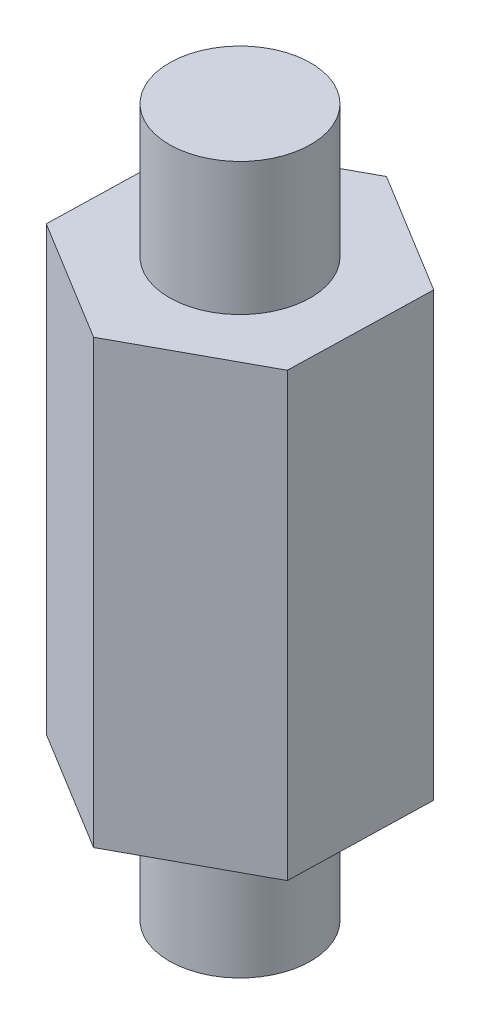
ISO-10303-21;
HEADER;
FILE_DESCRIPTION(('STEP AP214'),'2;1');
FILE_NAME('part.step','',(''),(''),'','','');
FILE_SCHEMA(('AUTOMOTIVE_DESIGN { 1 0 10303 214 1 1 1 1 }'));
ENDSEC;
DATA;
#1=APPLICATION_CONTEXT('core data for automotive mechanical design processes');
#2=APPLICATION_PROTOCOL_DEFINITION('international standard','automotive_design',2000,#1);
#3=PRODUCT_CONTEXT('',#1,'mechanical');
#4=PRODUCT('Part','Part','',(#3));
#5=PRODUCT_RELATED_PRODUCT_CATEGORY('part','',(#4));
#6=PRODUCT_DEFINITION_FORMATION('','',#4);
#7=PRODUCT_DEFINITION_CONTEXT('part definition',#1,'design');
#8=PRODUCT_DEFINITION('design','',#6,#7);
#9=PRODUCT_DEFINITION_SHAPE('','',#8);
#10=(LENGTH_UNIT() NAMED_UNIT(*) SI_UNIT(.MILLI.,.METRE.));
#11=(NAMED_UNIT(*) PLANE_ANGLE_UNIT() SI_UNIT($,.RADIAN.));
#12=(NAMED_UNIT(*) SI_UNIT($,.STERADIAN.) SOLID_ANGLE_UNIT());
#13=UNCERTAINTY_MEASURE_WITH_UNIT(LENGTH_MEASURE(1.E-05),#10,'distance_accuracy_value','');
#14=(GEOMETRIC_REPRESENTATION_CONTEXT(3) GLOBAL_UNCERTAINTY_ASSIGNED_CONTEXT((#13)) GLOBAL_UNIT_ASSIGNED_CONTEXT((#10,
#11,#12)) REPRESENTATION_CONTEXT('',''));
#15=CARTESIAN_POINT('',(0.,0.,0.));
#16=DIRECTION('',(0.,0.,1.));
#17=DIRECTION('',(1.,0.,0.));
#18=AXIS2_PLACEMENT_3D('',#15,#16,#17);
#19=CARTESIAN_POINT('',(0.,3.,0.));
#20=DIRECTION('',(0.,-1.,0.));
#21=DIRECTION('',(0.,0.,-1.));
#22=AXIS2_PLACEMENT_3D('',#19,#20,#21);
#23=CYLINDRICAL_SURFACE('',#22,1.6);
#24=CARTESIAN_POINT('',(0.,3.,0.));
#25=DIRECTION('',(0.,1.,0.));
#26=DIRECTION('',(0.,0.,1.));
#27=AXIS2_PLACEMENT_3D('',#24,#25,#26);
#28=CIRCLE('',#27,1.6);
#29=CARTESIAN_POINT('',(0.,3.,1.6));
#30=VERTEX_POINT('',#29);
#31=EDGE_CURVE('E53',#30,#30,#28,.T.);
#32=ORIENTED_EDGE('',*,*,#31,.F.);
#33=EDGE_LOOP('',(#32));
#34=FACE_BOUND('',#33,.T.);
#35=CARTESIAN_POINT('',(0.,0.,0.));
#36=DIRECTION('',(0.,1.,0.));
#37=DIRECTION('',(0.,0.,1.));
#38=AXIS2_PLACEMENT_3D('',#35,#36,#37);
#39=CIRCLE('',#38,1.6);
#40=CARTESIAN_POINT('',(0.,0.,1.6));
#41=VERTEX_POINT('',#40);
#42=EDGE_CURVE('E46',#41,#41,#39,.T.);
#43=ORIENTED_EDGE('',*,*,#42,.T.);
#44=EDGE_LOOP('',(#43));
#45=FACE_BOUND('',#44,.T.);
#46=ADVANCED_FACE('F43',(#34,#45),#23,.T.);
#47=CARTESIAN_POINT('',(0.,0.,0.));
#48=DIRECTION('',(0.,1.,0.));
#49=DIRECTION('',(0.,0.,1.));
#50=AXIS2_PLACEMENT_3D('',#47,#48,#49);
#51=PLANE('',#50);
#52=ORIENTED_EDGE('',*,*,#42,.F.);
#53=EDGE_LOOP('',(#52));
#54=FACE_BOUND('',#53,.T.);
#55=ADVANCED_FACE('F174',(#54),#51,.F.);
#56=CARTESIAN_POINT('',(-0.0820079833809002,13.,3.23087853629462));
#57=DIRECTION('',(-0.47786414110959,0.,-0.878433755408793));
#58=DIRECTION('',(-0.878433755408793,0.,0.47786414110959));
#59=AXIS2_PLACEMENT_3D('',#56,#57,#58);
#60=PLANE('',#59);
#61=DIRECTION('',(0.878433755408793,0.,-0.47786414110959));
#62=VECTOR('',#61,1.);
#63=CARTESIAN_POINT('',(-0.0820079833809002,3.,3.23087853629462));
#64=LINE('',#63,#62);
#65=CARTESIAN_POINT('',(-0.0820079833809002,3.,3.23087853629462));
#66=VERTEX_POINT('',#65);
#67=CARTESIAN_POINT('',(2.75701889728258,3.,1.6864602650683));
#68=VERTEX_POINT('',#67);
#69=EDGE_CURVE('E135',#66,#68,#64,.T.);
#70=ORIENTED_EDGE('',*,*,#69,.T.);
#71=DIRECTION('',(0.,-1.,0.));
#72=VECTOR('',#71,1.);
#73=CARTESIAN_POINT('',(2.75701889728258,13.,1.6864602650683));
#74=LINE('',#73,#72);
#75=CARTESIAN_POINT('',(2.75701889728258,13.,1.6864602650683));
#76=VERTEX_POINT('',#75);
#77=EDGE_CURVE('E163',#76,#68,#74,.T.);
#78=ORIENTED_EDGE('',*,*,#77,.F.);
#79=DIRECTION('',(0.878433755408793,0.,-0.47786414110959));
#80=VECTOR('',#79,1.);
#81=CARTESIAN_POINT('',(-0.0820079833809002,13.,3.23087853629462));
#82=LINE('',#81,#80);
#83=CARTESIAN_POINT('',(-0.0820079833809002,13.,3.23087853629462));
#84=VERTEX_POINT('',#83);
#85=EDGE_CURVE('E152',#84,#76,#82,.T.);
#86=ORIENTED_EDGE('',*,*,#85,.F.);
#87=DIRECTION('',(0.,-1.,0.));
#88=VECTOR('',#87,1.);
#89=CARTESIAN_POINT('',(-0.0820079833809002,13.,3.23087853629462));
#90=LINE('',#89,#88);
#91=EDGE_CURVE('E131',#84,#66,#90,.T.);
#92=ORIENTED_EDGE('',*,*,#91,.T.);
#93=EDGE_LOOP('',(#70,#78,#86,#92));
#94=FACE_BOUND('',#93,.T.);
#95=ADVANCED_FACE('F176',(#94),#60,.F.);
#96=CARTESIAN_POINT('',(2.75701889728258,13.,1.6864602650683));
#97=DIRECTION('',(-0.999678018280575,0.,-0.02537439194586));
#98=DIRECTION('',(-0.02537439194586,0.,0.999678018280575));
#99=AXIS2_PLACEMENT_3D('',#96,#97,#98);
#100=PLANE('',#99);
#101=DIRECTION('',(0.02537439194586,0.,-0.999678018280575));
#102=VECTOR('',#101,1.);
#103=CARTESIAN_POINT('',(2.75701889728258,3.,1.6864602650683));
#104=LINE('',#103,#102);
#105=CARTESIAN_POINT('',(2.83902688066348,3.,-1.54441827122632));
#106=VERTEX_POINT('',#105);
#107=EDGE_CURVE('E139',#68,#106,#104,.T.);
#108=ORIENTED_EDGE('',*,*,#107,.T.);
#109=DIRECTION('',(0.,-1.,0.));
#110=VECTOR('',#109,1.);
#111=CARTESIAN_POINT('',(2.83902688066348,13.,-1.54441827122632));
#112=LINE('',#111,#110);
#113=CARTESIAN_POINT('',(2.83902688066348,13.,-1.54441827122632));
#114=VERTEX_POINT('',#113);
#115=EDGE_CURVE('E159',#114,#106,#112,.T.);
#116=ORIENTED_EDGE('',*,*,#115,.F.);
#117=DIRECTION('',(0.02537439194586,0.,-0.999678018280575));
#118=VECTOR('',#117,1.);
#119=CARTESIAN_POINT('',(2.75701889728258,13.,1.6864602650683));
#120=LINE('',#119,#118);
#121=EDGE_CURVE('E100',#76,#114,#120,.T.);
#122=ORIENTED_EDGE('',*,*,#121,.F.);
#123=ORIENTED_EDGE('',*,*,#77,.T.);
#124=EDGE_LOOP('',(#108,#116,#122,#123));
#125=FACE_BOUND('',#124,.T.);
#126=ADVANCED_FACE('F181',(#125),#100,.F.);
#127=CARTESIAN_POINT('',(2.83902688066348,13.,-1.54441827122632));
#128=DIRECTION('',(-0.521813877170986,0.,0.853059363462932));
#129=DIRECTION('',(0.853059363462933,0.,0.521813877170986));
#130=AXIS2_PLACEMENT_3D('',#127,#128,#129);
#131=PLANE('',#130);
#132=DIRECTION('',(-0.853059363462932,0.,-0.521813877170986));
#133=VECTOR('',#132,1.);
#134=CARTESIAN_POINT('',(2.83902688066348,3.,-1.54441827122632));
#135=LINE('',#134,#133);
#136=CARTESIAN_POINT('',(0.0820079833809024,3.,-3.23087853629462));
#137=VERTEX_POINT('',#136);
#138=EDGE_CURVE('E143',#106,#137,#135,.T.);
#139=ORIENTED_EDGE('',*,*,#138,.T.);
#140=DIRECTION('',(0.,-1.,0.));
#141=VECTOR('',#140,1.);
#142=CARTESIAN_POINT('',(0.0820079833809024,13.,-3.23087853629462));
#143=LINE('',#142,#141);
#144=CARTESIAN_POINT('',(0.0820079833809024,13.,-3.23087853629462));
#145=VERTEX_POINT('',#144);
#146=EDGE_CURVE('E124',#145,#137,#143,.T.);
#147=ORIENTED_EDGE('',*,*,#146,.F.);
#148=DIRECTION('',(-0.853059363462932,0.,-0.521813877170986));
#149=VECTOR('',#148,1.);
#150=CARTESIAN_POINT('',(2.83902688066348,13.,-1.54441827122632));
#151=LINE('',#150,#149);
#152=EDGE_CURVE('E113',#114,#145,#151,.T.);
#153=ORIENTED_EDGE('',*,*,#152,.F.);
#154=ORIENTED_EDGE('',*,*,#115,.T.);
#155=EDGE_LOOP('',(#139,#147,#153,#154));
#156=FACE_BOUND('',#155,.T.);
#157=ADVANCED_FACE('F188',(#156),#131,.F.);
#158=CARTESIAN_POINT('',(0.0820079833809024,13.,-3.23087853629462));
#159=DIRECTION('',(0.47786414110959,0.,0.878433755408793));
#160=DIRECTION('',(0.878433755408793,0.,-0.47786414110959));
#161=AXIS2_PLACEMENT_3D('',#158,#159,#160);
#162=PLANE('',#161);
#163=DIRECTION('',(-0.878433755408793,0.,0.47786414110959));
#164=VECTOR('',#163,1.);
#165=CARTESIAN_POINT('',(0.0820079833809024,3.,-3.23087853629462));
#166=LINE('',#165,#164);
#167=CARTESIAN_POINT('',(-2.75701889728257,3.,-1.6864602650683));
#168=VERTEX_POINT('',#167);
#169=EDGE_CURVE('E122',#137,#168,#166,.T.);
#170=ORIENTED_EDGE('',*,*,#169,.T.);
#171=DIRECTION('',(0.,-1.,0.));
#172=VECTOR('',#171,1.);
#173=CARTESIAN_POINT('',(-2.75701889728257,13.,-1.6864602650683));
#174=LINE('',#173,#172);
#175=CARTESIAN_POINT('',(-2.75701889728257,13.,-1.6864602650683));
#176=VERTEX_POINT('',#175);
#177=EDGE_CURVE('E119',#176,#168,#174,.T.);
#178=ORIENTED_EDGE('',*,*,#177,.F.);
#179=DIRECTION('',(-0.878433755408793,0.,0.47786414110959));
#180=VECTOR('',#179,1.);
#181=CARTESIAN_POINT('',(0.0820079833809024,13.,-3.23087853629462));
#182=LINE('',#181,#180);
#183=EDGE_CURVE('E107',#145,#176,#182,.T.);
#184=ORIENTED_EDGE('',*,*,#183,.F.);
#185=ORIENTED_EDGE('',*,*,#146,.T.);
#186=EDGE_LOOP('',(#170,#178,#184,#185));
#187=FACE_BOUND('',#186,.T.);
#188=ADVANCED_FACE('F120',(#187),#162,.F.);
#189=CARTESIAN_POINT('',(-2.75701889728257,13.,-1.6864602650683));
#190=DIRECTION('',(0.999678018280575,0.,0.02537439194586));
#191=DIRECTION('',(0.02537439194586,0.,-0.999678018280575));
#192=AXIS2_PLACEMENT_3D('',#189,#190,#191);
#193=PLANE('',#192);
#194=DIRECTION('',(-0.02537439194586,0.,0.999678018280575));
#195=VECTOR('',#194,1.);
#196=CARTESIAN_POINT('',(-2.75701889728257,3.,-1.6864602650683));
#197=LINE('',#196,#195);
#198=CARTESIAN_POINT('',(-2.83902688066348,3.,1.54441827122632));
#199=VERTEX_POINT('',#198);
#200=EDGE_CURVE('E85',#168,#199,#197,.T.);
#201=ORIENTED_EDGE('',*,*,#200,.T.);
#202=DIRECTION('',(0.,-1.,0.));
#203=VECTOR('',#202,1.);
#204=CARTESIAN_POINT('',(-2.83902688066348,13.,1.54441827122632));
#205=LINE('',#204,#203);
#206=CARTESIAN_POINT('',(-2.83902688066348,13.,1.54441827122632));
#207=VERTEX_POINT('',#206);
#208=EDGE_CURVE('E125',#207,#199,#205,.T.);
#209=ORIENTED_EDGE('',*,*,#208,.F.);
#210=DIRECTION('',(-0.02537439194586,0.,0.999678018280575));
#211=VECTOR('',#210,1.);
#212=CARTESIAN_POINT('',(-2.75701889728257,13.,-1.6864602650683));
#213=LINE('',#212,#211);
#214=EDGE_CURVE('E111',#176,#207,#213,.T.);
#215=ORIENTED_EDGE('',*,*,#214,.F.);
#216=ORIENTED_EDGE('',*,*,#177,.T.);
#217=EDGE_LOOP('',(#201,#209,#215,#216));
#218=FACE_BOUND('',#217,.T.);
#219=ADVANCED_FACE('F127',(#218),#193,.F.);
#220=CARTESIAN_POINT('',(-2.83902688066348,13.,1.54441827122632));
#221=DIRECTION('',(0.521813877170985,0.,-0.853059363462933));
#222=DIRECTION('',(-0.853059363462933,0.,-0.521813877170985));
#223=AXIS2_PLACEMENT_3D('',#220,#221,#222);
#224=PLANE('',#223);
#225=DIRECTION('',(0.853059363462932,0.,0.521813877170985));
#226=VECTOR('',#225,1.);
#227=CARTESIAN_POINT('',(-2.83902688066348,3.,1.54441827122632));
#228=LINE('',#227,#226);
#229=EDGE_CURVE('E91',#199,#66,#228,.T.);
#230=ORIENTED_EDGE('',*,*,#229,.T.);
#231=ORIENTED_EDGE('',*,*,#91,.F.);
#232=DIRECTION('',(0.853059363462932,0.,0.521813877170985));
#233=VECTOR('',#232,1.);
#234=CARTESIAN_POINT('',(-2.83902688066348,13.,1.54441827122632));
#235=LINE('',#234,#233);
#236=EDGE_CURVE('E62',#207,#84,#235,.T.);
#237=ORIENTED_EDGE('',*,*,#236,.F.);
#238=ORIENTED_EDGE('',*,*,#208,.T.);
#239=EDGE_LOOP('',(#230,#231,#237,#238));
#240=FACE_BOUND('',#239,.T.);
#241=ADVANCED_FACE('F196',(#240),#224,.F.);
#242=CARTESIAN_POINT('',(0.,13.,0.));
#243=DIRECTION('',(0.,1.,0.));
#244=DIRECTION('',(0.,0.,1.));
#245=AXIS2_PLACEMENT_3D('',#242,#243,#244);
#246=PLANE('',#245);
#247=CARTESIAN_POINT('',(0.,13.,0.));
#248=DIRECTION('',(0.,1.,0.));
#249=DIRECTION('',(0.,0.,1.));
#250=AXIS2_PLACEMENT_3D('',#247,#248,#249);
#251=CIRCLE('',#250,1.6);
#252=CARTESIAN_POINT('',(0.,13.,1.6));
#253=VERTEX_POINT('',#252);
#254=EDGE_CURVE('E11',#253,#253,#251,.T.);
#255=ORIENTED_EDGE('',*,*,#254,.F.);
#256=EDGE_LOOP('',(#255));
#257=FACE_BOUND('',#256,.T.);
#258=ORIENTED_EDGE('',*,*,#85,.T.);
#259=ORIENTED_EDGE('',*,*,#121,.T.);
#260=ORIENTED_EDGE('',*,*,#152,.T.);
#261=ORIENTED_EDGE('',*,*,#183,.T.);
#262=ORIENTED_EDGE('',*,*,#214,.T.);
#263=ORIENTED_EDGE('',*,*,#236,.T.);
#264=EDGE_LOOP('',(#258,#259,#260,#261,#262,#263));
#265=FACE_BOUND('',#264,.T.);
#266=ADVANCED_FACE('F109',(#257,#265),#246,.T.);
#267=CARTESIAN_POINT('',(0.,3.,0.));
#268=DIRECTION('',(0.,1.,0.));
#269=DIRECTION('',(0.,0.,1.));
#270=AXIS2_PLACEMENT_3D('',#267,#268,#269);
#271=PLANE('',#270);
#272=ORIENTED_EDGE('',*,*,#31,.T.);
#273=EDGE_LOOP('',(#272));
#274=FACE_BOUND('',#273,.T.);
#275=ORIENTED_EDGE('',*,*,#69,.F.);
#276=ORIENTED_EDGE('',*,*,#229,.F.);
#277=ORIENTED_EDGE('',*,*,#200,.F.);
#278=ORIENTED_EDGE('',*,*,#169,.F.);
#279=ORIENTED_EDGE('',*,*,#138,.F.);
#280=ORIENTED_EDGE('',*,*,#107,.F.);
#281=EDGE_LOOP('',(#275,#276,#277,#278,#279,#280));
#282=FACE_BOUND('',#281,.T.);
#283=ADVANCED_FACE('F199',(#274,#282),#271,.F.);
#284=CARTESIAN_POINT('',(0.,16.,0.));
#285=DIRECTION('',(0.,-1.,0.));
#286=DIRECTION('',(0.,0.,-1.));
#287=AXIS2_PLACEMENT_3D('',#284,#285,#286);
#288=CYLINDRICAL_SURFACE('',#287,1.6);
#289=CARTESIAN_POINT('',(0.,16.,0.));
#290=DIRECTION('',(0.,1.,0.));
#291=DIRECTION('',(0.,0.,1.));
#292=AXIS2_PLACEMENT_3D('',#289,#290,#291);
#293=CIRCLE('',#292,1.6);
#294=CARTESIAN_POINT('',(0.,16.,1.6));
#295=VERTEX_POINT('',#294);
#296=EDGE_CURVE('E140',#295,#295,#293,.T.);
#297=ORIENTED_EDGE('',*,*,#296,.F.);
#298=EDGE_LOOP('',(#297));
#299=FACE_BOUND('',#298,.T.);
#300=ORIENTED_EDGE('',*,*,#254,.T.);
#301=EDGE_LOOP('',(#300));
#302=FACE_BOUND('',#301,.T.);
#303=ADVANCED_FACE('F202',(#299,#302),#288,.T.);
#304=CARTESIAN_POINT('',(0.,16.,0.));
#305=DIRECTION('',(0.,1.,0.));
#306=DIRECTION('',(0.,0.,1.));
#307=AXIS2_PLACEMENT_3D('',#304,#305,#306);
#308=PLANE('',#307);
#309=ORIENTED_EDGE('',*,*,#296,.T.);
#310=EDGE_LOOP('',(#309));
#311=FACE_BOUND('',#310,.T.);
#312=ADVANCED_FACE('F208',(#311),#308,.T.);
#313=CLOSED_SHELL('',(#46,#55,#95,#126,#157,#188,#219,#241,#266,#283,#303,#312));
#314=MANIFOLD_SOLID_BREP('B2',#313);
#315=ADVANCED_BREP_SHAPE_REPRESENTATION('',(#18,#314),#14);
#316=SHAPE_DEFINITION_REPRESENTATION(#9,#315);
ENDSEC;
END-ISO-10303-21;
